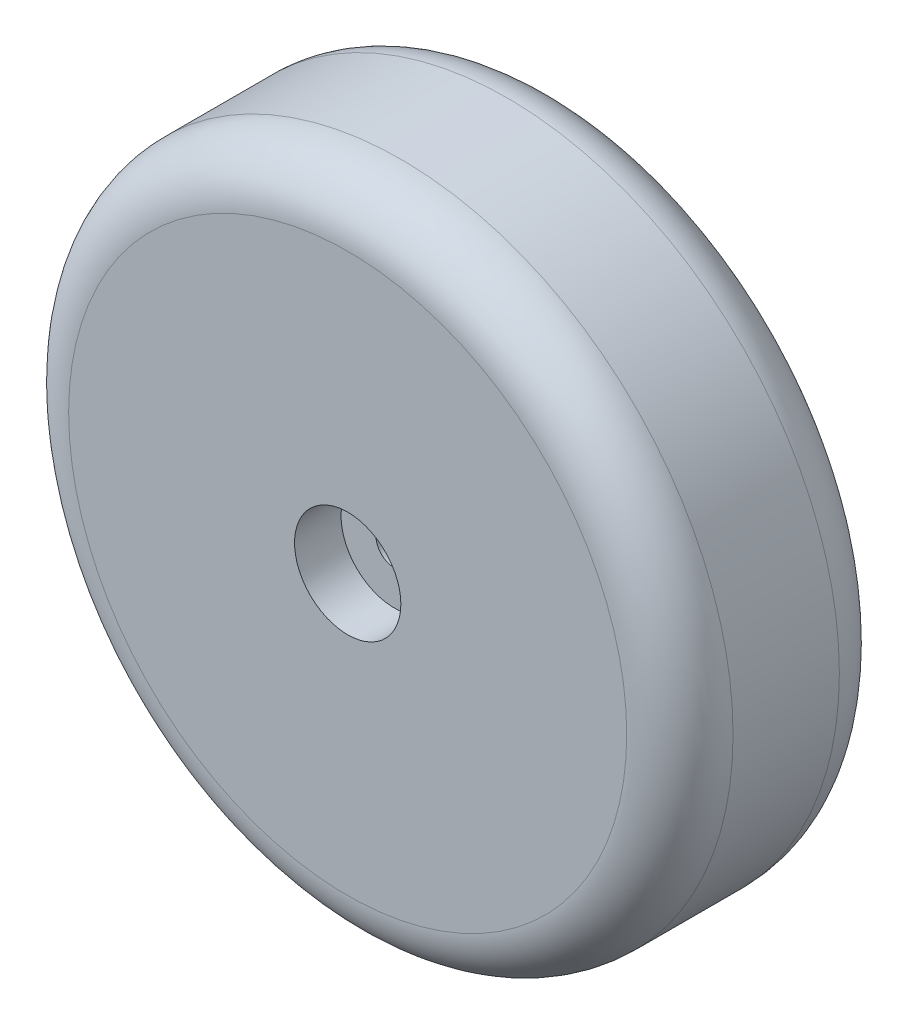
ISO-10303-21;
HEADER;
FILE_DESCRIPTION(('STEP AP214'),'2;1');
FILE_NAME('part.step','',(''),(''),'','','');
FILE_SCHEMA(('AUTOMOTIVE_DESIGN { 1 0 10303 214 1 1 1 1 }'));
ENDSEC;
DATA;
#1=APPLICATION_CONTEXT('core data for automotive mechanical design processes');
#2=APPLICATION_PROTOCOL_DEFINITION('international standard','automotive_design',2000,#1);
#3=PRODUCT_CONTEXT('',#1,'mechanical');
#4=PRODUCT('Part','Part','',(#3));
#5=PRODUCT_RELATED_PRODUCT_CATEGORY('part','',(#4));
#6=PRODUCT_DEFINITION_FORMATION('','',#4);
#7=PRODUCT_DEFINITION_CONTEXT('part definition',#1,'design');
#8=PRODUCT_DEFINITION('design','',#6,#7);
#9=PRODUCT_DEFINITION_SHAPE('','',#8);
#10=(LENGTH_UNIT() NAMED_UNIT(*) SI_UNIT(.MILLI.,.METRE.));
#11=(NAMED_UNIT(*) PLANE_ANGLE_UNIT() SI_UNIT($,.RADIAN.));
#12=(NAMED_UNIT(*) SI_UNIT($,.STERADIAN.) SOLID_ANGLE_UNIT());
#13=UNCERTAINTY_MEASURE_WITH_UNIT(LENGTH_MEASURE(1.E-05),#10,'distance_accuracy_value','');
#14=(GEOMETRIC_REPRESENTATION_CONTEXT(3) GLOBAL_UNCERTAINTY_ASSIGNED_CONTEXT((#13)) GLOBAL_UNIT_ASSIGNED_CONTEXT((#10,
#11,#12)) REPRESENTATION_CONTEXT('',''));
#15=CARTESIAN_POINT('',(0.,0.,0.));
#16=DIRECTION('',(0.,0.,1.));
#17=DIRECTION('',(1.,0.,0.));
#18=AXIS2_PLACEMENT_3D('',#15,#16,#17);
#19=CARTESIAN_POINT('',(0.,0.,0.));
#20=DIRECTION('',(0.,0.,1.));
#21=DIRECTION('',(1.,0.,0.));
#22=AXIS2_PLACEMENT_3D('',#19,#20,#21);
#23=CYLINDRICAL_SURFACE('',#22,2.75);
#24=CARTESIAN_POINT('',(0.,0.,25.));
#25=DIRECTION('',(0.,0.,1.));
#26=DIRECTION('',(1.,0.,0.));
#27=AXIS2_PLACEMENT_3D('',#24,#25,#26);
#28=CIRCLE('',#27,2.75);
#29=CARTESIAN_POINT('',(2.75,0.,25.));
#30=VERTEX_POINT('',#29);
#31=EDGE_CURVE('E52',#30,#30,#28,.F.);
#32=ORIENTED_EDGE('',*,*,#31,.F.);
#33=EDGE_LOOP('',(#32));
#34=FACE_BOUND('',#33,.T.);
#35=CARTESIAN_POINT('',(0.,0.,7.));
#36=DIRECTION('',(0.,0.,-1.));
#37=DIRECTION('',(-1.,0.,0.));
#38=AXIS2_PLACEMENT_3D('',#35,#36,#37);
#39=CIRCLE('',#38,2.75);
#40=CARTESIAN_POINT('',(-2.75,0.,7.));
#41=VERTEX_POINT('',#40);
#42=EDGE_CURVE('E40',#41,#41,#39,.F.);
#43=ORIENTED_EDGE('',*,*,#42,.F.);
#44=EDGE_LOOP('',(#43));
#45=FACE_BOUND('',#44,.T.);
#46=ADVANCED_FACE('F36',(#34,#45),#23,.F.);
#47=CARTESIAN_POINT('',(0.,0.,32.));
#48=DIRECTION('',(0.,0.,-1.));
#49=DIRECTION('',(-1.,0.,0.));
#50=AXIS2_PLACEMENT_3D('',#47,#48,#49);
#51=CYLINDRICAL_SURFACE('',#50,50.);
#52=CARTESIAN_POINT('',(0.,0.,8.));
#53=DIRECTION('',(0.,0.,1.));
#54=DIRECTION('',(1.,0.,0.));
#55=AXIS2_PLACEMENT_3D('',#52,#53,#54);
#56=CIRCLE('',#55,50.);
#57=CARTESIAN_POINT('',(50.,0.,8.));
#58=VERTEX_POINT('',#57);
#59=EDGE_CURVE('E49',#58,#58,#56,.T.);
#60=ORIENTED_EDGE('',*,*,#59,.T.);
#61=EDGE_LOOP('',(#60));
#62=FACE_BOUND('',#61,.T.);
#63=CARTESIAN_POINT('',(0.,0.,24.));
#64=DIRECTION('',(0.,0.,1.));
#65=DIRECTION('',(1.,0.,0.));
#66=AXIS2_PLACEMENT_3D('',#63,#64,#65);
#67=CIRCLE('',#66,50.);
#68=CARTESIAN_POINT('',(50.,0.,24.));
#69=VERTEX_POINT('',#68);
#70=EDGE_CURVE('E54',#69,#69,#67,.F.);
#71=ORIENTED_EDGE('',*,*,#70,.T.);
#72=EDGE_LOOP('',(#71));
#73=FACE_BOUND('',#72,.T.);
#74=ADVANCED_FACE('F73',(#62,#73),#51,.T.);
#75=CARTESIAN_POINT('',(0.,0.,32.));
#76=DIRECTION('',(0.,0.,1.));
#77=DIRECTION('',(1.,0.,0.));
#78=AXIS2_PLACEMENT_3D('',#75,#76,#77);
#79=PLANE('',#78);
#80=CARTESIAN_POINT('',(0.,0.,32.));
#81=DIRECTION('',(0.,0.,1.));
#82=DIRECTION('',(1.,0.,0.));
#83=AXIS2_PLACEMENT_3D('',#80,#81,#82);
#84=CIRCLE('',#83,8.);
#85=CARTESIAN_POINT('',(8.,0.,32.));
#86=VERTEX_POINT('',#85);
#87=EDGE_CURVE('E61',#86,#86,#84,.T.);
#88=ORIENTED_EDGE('',*,*,#87,.F.);
#89=EDGE_LOOP('',(#88));
#90=FACE_BOUND('',#89,.T.);
#91=CARTESIAN_POINT('',(0.,0.,32.));
#92=DIRECTION('',(0.,0.,1.));
#93=DIRECTION('',(1.,0.,0.));
#94=AXIS2_PLACEMENT_3D('',#91,#92,#93);
#95=CIRCLE('',#94,42.);
#96=CARTESIAN_POINT('',(42.,0.,32.));
#97=VERTEX_POINT('',#96);
#98=EDGE_CURVE('E10',#97,#97,#95,.T.);
#99=ORIENTED_EDGE('',*,*,#98,.T.);
#100=EDGE_LOOP('',(#99));
#101=FACE_BOUND('',#100,.T.);
#102=ADVANCED_FACE('F86',(#90,#101),#79,.T.);
#103=CARTESIAN_POINT('',(0.,0.,0.));
#104=DIRECTION('',(0.,0.,1.));
#105=DIRECTION('',(1.,0.,0.));
#106=AXIS2_PLACEMENT_3D('',#103,#104,#105);
#107=PLANE('',#106);
#108=CARTESIAN_POINT('',(0.,0.,0.));
#109=DIRECTION('',(0.,0.,-1.));
#110=DIRECTION('',(-1.,0.,0.));
#111=AXIS2_PLACEMENT_3D('',#108,#109,#110);
#112=CIRCLE('',#111,8.);
#113=CARTESIAN_POINT('',(-8.,0.,0.));
#114=VERTEX_POINT('',#113);
#115=EDGE_CURVE('E68',#114,#114,#112,.T.);
#116=ORIENTED_EDGE('',*,*,#115,.F.);
#117=EDGE_LOOP('',(#116));
#118=FACE_BOUND('',#117,.T.);
#119=CARTESIAN_POINT('',(0.,0.,0.));
#120=DIRECTION('',(0.,0.,1.));
#121=DIRECTION('',(1.,0.,0.));
#122=AXIS2_PLACEMENT_3D('',#119,#120,#121);
#123=CIRCLE('',#122,42.);
#124=CARTESIAN_POINT('',(42.,0.,0.));
#125=VERTEX_POINT('',#124);
#126=EDGE_CURVE('E44',#125,#125,#123,.F.);
#127=ORIENTED_EDGE('',*,*,#126,.T.);
#128=EDGE_LOOP('',(#127));
#129=FACE_BOUND('',#128,.T.);
#130=ADVANCED_FACE('F78',(#118,#129),#107,.F.);
#131=CARTESIAN_POINT('',(0.,0.,8.));
#132=DIRECTION('',(0.,0.,1.));
#133=DIRECTION('',(1.,0.,0.));
#134=AXIS2_PLACEMENT_3D('',#131,#132,#133);
#135=TOROIDAL_SURFACE('',#134,42.,8.);
#136=ORIENTED_EDGE('',*,*,#126,.F.);
#137=EDGE_LOOP('',(#136));
#138=FACE_BOUND('',#137,.T.);
#139=ORIENTED_EDGE('',*,*,#59,.F.);
#140=EDGE_LOOP('',(#139));
#141=FACE_BOUND('',#140,.T.);
#142=ADVANCED_FACE('F76',(#138,#141),#135,.T.);
#143=CARTESIAN_POINT('',(0.,0.,24.));
#144=DIRECTION('',(0.,0.,1.));
#145=DIRECTION('',(1.,0.,0.));
#146=AXIS2_PLACEMENT_3D('',#143,#144,#145);
#147=TOROIDAL_SURFACE('',#146,42.,8.);
#148=ORIENTED_EDGE('',*,*,#70,.F.);
#149=EDGE_LOOP('',(#148));
#150=FACE_BOUND('',#149,.T.);
#151=ORIENTED_EDGE('',*,*,#98,.F.);
#152=EDGE_LOOP('',(#151));
#153=FACE_BOUND('',#152,.T.);
#154=ADVANCED_FACE('F38',(#150,#153),#147,.T.);
#155=CARTESIAN_POINT('',(0.,0.,25.));
#156=DIRECTION('',(0.,0.,1.));
#157=DIRECTION('',(1.,0.,0.));
#158=AXIS2_PLACEMENT_3D('',#155,#156,#157);
#159=PLANE('',#158);
#160=CARTESIAN_POINT('',(0.,0.,25.));
#161=DIRECTION('',(0.,0.,1.));
#162=DIRECTION('',(1.,0.,0.));
#163=AXIS2_PLACEMENT_3D('',#160,#161,#162);
#164=CIRCLE('',#163,8.);
#165=CARTESIAN_POINT('',(8.,0.,25.));
#166=VERTEX_POINT('',#165);
#167=EDGE_CURVE('E55',#166,#166,#164,.T.);
#168=ORIENTED_EDGE('',*,*,#167,.T.);
#169=EDGE_LOOP('',(#168));
#170=FACE_BOUND('',#169,.T.);
#171=ORIENTED_EDGE('',*,*,#31,.T.);
#172=EDGE_LOOP('',(#171));
#173=FACE_BOUND('',#172,.T.);
#174=ADVANCED_FACE('F84',(#170,#173),#159,.T.);
#175=CARTESIAN_POINT('',(0.,0.,25.));
#176=DIRECTION('',(0.,0.,1.));
#177=DIRECTION('',(1.,0.,0.));
#178=AXIS2_PLACEMENT_3D('',#175,#176,#177);
#179=CYLINDRICAL_SURFACE('',#178,8.);
#180=ORIENTED_EDGE('',*,*,#167,.F.);
#181=EDGE_LOOP('',(#180));
#182=FACE_BOUND('',#181,.T.);
#183=ORIENTED_EDGE('',*,*,#87,.T.);
#184=EDGE_LOOP('',(#183));
#185=FACE_BOUND('',#184,.T.);
#186=ADVANCED_FACE('F100',(#182,#185),#179,.F.);
#187=CARTESIAN_POINT('',(0.,0.,7.));
#188=DIRECTION('',(0.,0.,-1.));
#189=DIRECTION('',(-1.,0.,0.));
#190=AXIS2_PLACEMENT_3D('',#187,#188,#189);
#191=PLANE('',#190);
#192=CARTESIAN_POINT('',(0.,0.,7.));
#193=DIRECTION('',(0.,0.,-1.));
#194=DIRECTION('',(-1.,0.,0.));
#195=AXIS2_PLACEMENT_3D('',#192,#193,#194);
#196=CIRCLE('',#195,8.);
#197=CARTESIAN_POINT('',(-8.,0.,7.));
#198=VERTEX_POINT('',#197);
#199=EDGE_CURVE('E128',#198,#198,#196,.T.);
#200=ORIENTED_EDGE('',*,*,#199,.T.);
#201=EDGE_LOOP('',(#200));
#202=FACE_BOUND('',#201,.T.);
#203=ORIENTED_EDGE('',*,*,#42,.T.);
#204=EDGE_LOOP('',(#203));
#205=FACE_BOUND('',#204,.T.);
#206=ADVANCED_FACE('F109',(#202,#205),#191,.T.);
#207=CARTESIAN_POINT('',(0.,0.,7.));
#208=DIRECTION('',(0.,0.,-1.));
#209=DIRECTION('',(-1.,0.,0.));
#210=AXIS2_PLACEMENT_3D('',#207,#208,#209);
#211=CYLINDRICAL_SURFACE('',#210,8.);
#212=ORIENTED_EDGE('',*,*,#199,.F.);
#213=EDGE_LOOP('',(#212));
#214=FACE_BOUND('',#213,.T.);
#215=ORIENTED_EDGE('',*,*,#115,.T.);
#216=EDGE_LOOP('',(#215));
#217=FACE_BOUND('',#216,.T.);
#218=ADVANCED_FACE('F115',(#214,#217),#211,.F.);
#219=CLOSED_SHELL('',(#46,#74,#102,#130,#142,#154,#174,#186,#206,#218));
#220=MANIFOLD_SOLID_BREP('B2',#219);
#221=ADVANCED_BREP_SHAPE_REPRESENTATION('',(#18,#220),#14);
#222=SHAPE_DEFINITION_REPRESENTATION(#9,#221);
ENDSEC;
END-ISO-10303-21;
